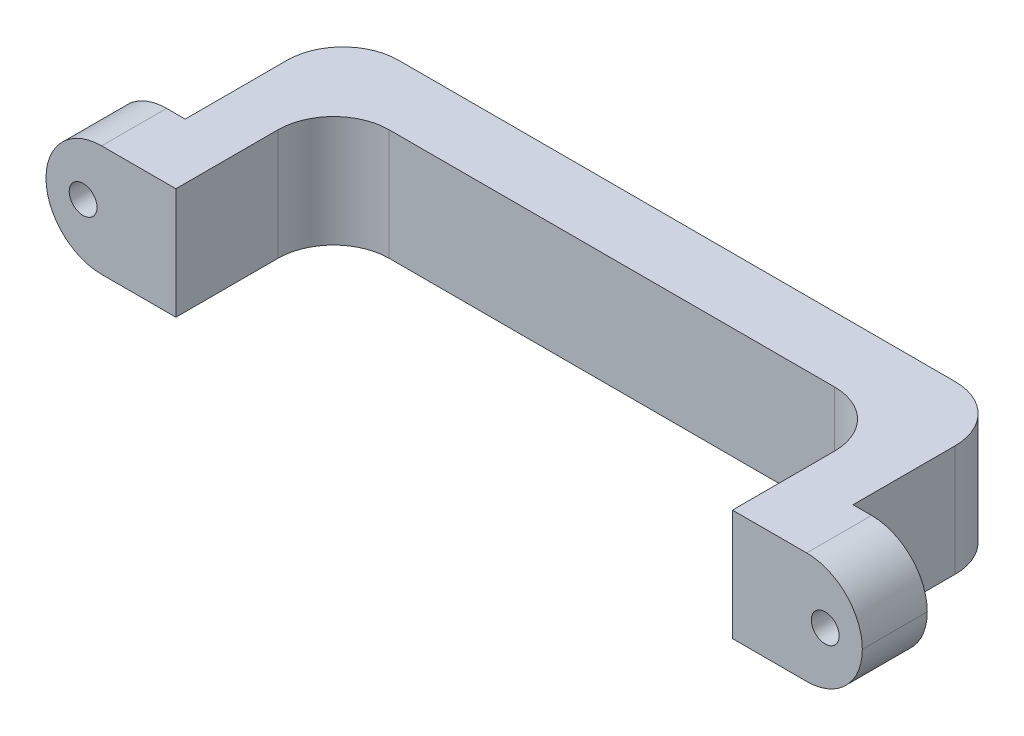
ISO-10303-21;
HEADER;
FILE_DESCRIPTION(('STEP AP214'),'2;1');
FILE_NAME('part.step','',(''),(''),'','','');
FILE_SCHEMA(('AUTOMOTIVE_DESIGN { 1 0 10303 214 1 1 1 1 }'));
ENDSEC;
DATA;
#1=APPLICATION_CONTEXT('core data for automotive mechanical design processes');
#2=APPLICATION_PROTOCOL_DEFINITION('international standard','automotive_design',2000,#1);
#3=PRODUCT_CONTEXT('',#1,'mechanical');
#4=PRODUCT('Part','Part','',(#3));
#5=PRODUCT_RELATED_PRODUCT_CATEGORY('part','',(#4));
#6=PRODUCT_DEFINITION_FORMATION('','',#4);
#7=PRODUCT_DEFINITION_CONTEXT('part definition',#1,'design');
#8=PRODUCT_DEFINITION('design','',#6,#7);
#9=PRODUCT_DEFINITION_SHAPE('','',#8);
#10=(LENGTH_UNIT() NAMED_UNIT(*) SI_UNIT(.MILLI.,.METRE.));
#11=(NAMED_UNIT(*) PLANE_ANGLE_UNIT() SI_UNIT($,.RADIAN.));
#12=(NAMED_UNIT(*) SI_UNIT($,.STERADIAN.) SOLID_ANGLE_UNIT());
#13=UNCERTAINTY_MEASURE_WITH_UNIT(LENGTH_MEASURE(1.E-05),#10,'distance_accuracy_value','');
#14=(GEOMETRIC_REPRESENTATION_CONTEXT(3) GLOBAL_UNCERTAINTY_ASSIGNED_CONTEXT((#13)) GLOBAL_UNIT_ASSIGNED_CONTEXT((#10,
#11,#12)) REPRESENTATION_CONTEXT('',''));
#15=CARTESIAN_POINT('',(0.,0.,0.));
#16=DIRECTION('',(0.,0.,1.));
#17=DIRECTION('',(1.,0.,0.));
#18=AXIS2_PLACEMENT_3D('',#15,#16,#17);
#19=CARTESIAN_POINT('',(0.,12.,0.));
#20=DIRECTION('',(0.,0.,-1.));
#21=DIRECTION('',(-1.,0.,0.));
#22=AXIS2_PLACEMENT_3D('',#19,#20,#21);
#23=PLANE('',#22);
#24=CARTESIAN_POINT('',(4.,6.,0.));
#25=DIRECTION('',(0.,0.,-1.));
#26=DIRECTION('',(-1.,0.,0.));
#27=AXIS2_PLACEMENT_3D('',#24,#25,#26);
#28=CIRCLE('',#27,1.5);
#29=CARTESIAN_POINT('',(2.5,6.,0.));
#30=VERTEX_POINT('',#29);
#31=EDGE_CURVE('E339',#30,#30,#28,.T.);
#32=ORIENTED_EDGE('',*,*,#31,.T.);
#33=EDGE_LOOP('',(#32));
#34=FACE_BOUND('',#33,.T.);
#35=DIRECTION('',(1.,0.,0.));
#36=VECTOR('',#35,1.);
#37=CARTESIAN_POINT('',(0.,12.,0.));
#38=LINE('',#37,#36);
#39=CARTESIAN_POINT('',(6.,12.,0.));
#40=VERTEX_POINT('',#39);
#41=CARTESIAN_POINT('',(14.,12.,0.));
#42=VERTEX_POINT('',#41);
#43=EDGE_CURVE('E162',#40,#42,#38,.T.);
#44=ORIENTED_EDGE('',*,*,#43,.F.);
#45=CARTESIAN_POINT('',(6.,6.,0.));
#46=DIRECTION('',(0.,0.,-1.));
#47=DIRECTION('',(-1.,0.,0.));
#48=AXIS2_PLACEMENT_3D('',#45,#46,#47);
#49=CIRCLE('',#48,6.);
#50=CARTESIAN_POINT('',(0.,6.,0.));
#51=VERTEX_POINT('',#50);
#52=EDGE_CURVE('E203',#40,#51,#49,.F.);
#53=ORIENTED_EDGE('',*,*,#52,.T.);
#54=CARTESIAN_POINT('',(6.,6.,0.));
#55=DIRECTION('',(0.,0.,-1.));
#56=DIRECTION('',(-1.,0.,0.));
#57=AXIS2_PLACEMENT_3D('',#54,#55,#56);
#58=CIRCLE('',#57,6.);
#59=CARTESIAN_POINT('',(6.,0.,0.));
#60=VERTEX_POINT('',#59);
#61=EDGE_CURVE('E201',#51,#60,#58,.F.);
#62=ORIENTED_EDGE('',*,*,#61,.T.);
#63=DIRECTION('',(1.,0.,0.));
#64=VECTOR('',#63,1.);
#65=CARTESIAN_POINT('',(0.,0.,0.));
#66=LINE('',#65,#64);
#67=CARTESIAN_POINT('',(14.,0.,0.));
#68=VERTEX_POINT('',#67);
#69=EDGE_CURVE('E184',#60,#68,#66,.T.);
#70=ORIENTED_EDGE('',*,*,#69,.T.);
#71=DIRECTION('',(0.,-1.,0.));
#72=VECTOR('',#71,1.);
#73=CARTESIAN_POINT('',(14.,12.,0.));
#74=LINE('',#73,#72);
#75=EDGE_CURVE('E178',#42,#68,#74,.T.);
#76=ORIENTED_EDGE('',*,*,#75,.F.);
#77=EDGE_LOOP('',(#44,#53,#62,#70,#76));
#78=FACE_BOUND('',#77,.T.);
#79=ADVANCED_FACE('F34',(#34,#78),#23,.F.);
#80=CARTESIAN_POINT('',(14.,12.,0.));
#81=DIRECTION('',(-1.,0.,0.));
#82=DIRECTION('',(0.,0.,1.));
#83=AXIS2_PLACEMENT_3D('',#80,#81,#82);
#84=PLANE('',#83);
#85=DIRECTION('',(0.,0.,-1.));
#86=VECTOR('',#85,1.);
#87=CARTESIAN_POINT('',(14.,0.,0.));
#88=LINE('',#87,#86);
#89=CARTESIAN_POINT('',(14.,0.,-11.));
#90=VERTEX_POINT('',#89);
#91=EDGE_CURVE('E313',#68,#90,#88,.T.);
#92=ORIENTED_EDGE('',*,*,#91,.T.);
#93=DIRECTION('',(0.,-1.,0.));
#94=VECTOR('',#93,1.);
#95=CARTESIAN_POINT('',(14.,12.,-11.));
#96=LINE('',#95,#94);
#97=CARTESIAN_POINT('',(14.,12.,-11.));
#98=VERTEX_POINT('',#97);
#99=EDGE_CURVE('E180',#90,#98,#96,.F.);
#100=ORIENTED_EDGE('',*,*,#99,.T.);
#101=DIRECTION('',(0.,0.,-1.));
#102=VECTOR('',#101,1.);
#103=CARTESIAN_POINT('',(14.,12.,0.));
#104=LINE('',#103,#102);
#105=EDGE_CURVE('E166',#42,#98,#104,.T.);
#106=ORIENTED_EDGE('',*,*,#105,.F.);
#107=ORIENTED_EDGE('',*,*,#75,.T.);
#108=EDGE_LOOP('',(#92,#100,#106,#107));
#109=FACE_BOUND('',#108,.T.);
#110=ADVANCED_FACE('F177',(#109),#84,.F.);
#111=CARTESIAN_POINT('',(74.,12.,-17.));
#112=DIRECTION('',(0.,0.,1.));
#113=DIRECTION('',(1.,0.,0.));
#114=AXIS2_PLACEMENT_3D('',#111,#112,#113);
#115=PLANE('',#114);
#116=DIRECTION('',(-1.,0.,0.));
#117=VECTOR('',#116,1.);
#118=CARTESIAN_POINT('',(74.,12.,-17.));
#119=LINE('',#118,#117);
#120=CARTESIAN_POINT('',(68.,12.,-17.));
#121=VERTEX_POINT('',#120);
#122=CARTESIAN_POINT('',(20.,12.,-17.));
#123=VERTEX_POINT('',#122);
#124=EDGE_CURVE('E181',#121,#123,#119,.T.);
#125=ORIENTED_EDGE('',*,*,#124,.T.);
#126=DIRECTION('',(0.,-1.,0.));
#127=VECTOR('',#126,1.);
#128=CARTESIAN_POINT('',(20.,12.,-17.));
#129=LINE('',#128,#127);
#130=CARTESIAN_POINT('',(20.,0.,-17.));
#131=VERTEX_POINT('',#130);
#132=EDGE_CURVE('E225',#123,#131,#129,.T.);
#133=ORIENTED_EDGE('',*,*,#132,.T.);
#134=DIRECTION('',(-1.,0.,0.));
#135=VECTOR('',#134,1.);
#136=CARTESIAN_POINT('',(74.,0.,-17.));
#137=LINE('',#136,#135);
#138=CARTESIAN_POINT('',(68.,0.,-17.));
#139=VERTEX_POINT('',#138);
#140=EDGE_CURVE('E316',#139,#131,#137,.T.);
#141=ORIENTED_EDGE('',*,*,#140,.F.);
#142=DIRECTION('',(0.,-1.,0.));
#143=VECTOR('',#142,1.);
#144=CARTESIAN_POINT('',(68.,12.,-17.));
#145=LINE('',#144,#143);
#146=EDGE_CURVE('E223',#139,#121,#145,.F.);
#147=ORIENTED_EDGE('',*,*,#146,.T.);
#148=EDGE_LOOP('',(#125,#133,#141,#147));
#149=FACE_BOUND('',#148,.T.);
#150=ADVANCED_FACE('F333',(#149),#115,.T.);
#151=CARTESIAN_POINT('',(74.,12.,0.));
#152=DIRECTION('',(-1.,0.,0.));
#153=DIRECTION('',(0.,0.,1.));
#154=AXIS2_PLACEMENT_3D('',#151,#152,#153);
#155=PLANE('',#154);
#156=DIRECTION('',(0.,0.,-1.));
#157=VECTOR('',#156,1.);
#158=CARTESIAN_POINT('',(74.,12.,0.));
#159=LINE('',#158,#157);
#160=CARTESIAN_POINT('',(74.,12.,0.));
#161=VERTEX_POINT('',#160);
#162=CARTESIAN_POINT('',(74.,12.,-11.));
#163=VERTEX_POINT('',#162);
#164=EDGE_CURVE('E303',#161,#163,#159,.T.);
#165=ORIENTED_EDGE('',*,*,#164,.T.);
#166=DIRECTION('',(0.,-1.,0.));
#167=VECTOR('',#166,1.);
#168=CARTESIAN_POINT('',(74.,0.,-11.));
#169=LINE('',#168,#167);
#170=CARTESIAN_POINT('',(74.,0.,-11.));
#171=VERTEX_POINT('',#170);
#172=EDGE_CURVE('E239',#163,#171,#169,.T.);
#173=ORIENTED_EDGE('',*,*,#172,.T.);
#174=DIRECTION('',(0.,0.,-1.));
#175=VECTOR('',#174,1.);
#176=CARTESIAN_POINT('',(74.,0.,0.));
#177=LINE('',#176,#175);
#178=CARTESIAN_POINT('',(74.,0.,0.));
#179=VERTEX_POINT('',#178);
#180=EDGE_CURVE('E277',#179,#171,#177,.T.);
#181=ORIENTED_EDGE('',*,*,#180,.F.);
#182=DIRECTION('',(0.,-1.,0.));
#183=VECTOR('',#182,1.);
#184=CARTESIAN_POINT('',(74.,12.,0.));
#185=LINE('',#184,#183);
#186=EDGE_CURVE('E187',#161,#179,#185,.T.);
#187=ORIENTED_EDGE('',*,*,#186,.F.);
#188=EDGE_LOOP('',(#165,#173,#181,#187));
#189=FACE_BOUND('',#188,.T.);
#190=ADVANCED_FACE('F324',(#189),#155,.T.);
#191=CARTESIAN_POINT('',(88.,12.,0.));
#192=DIRECTION('',(0.,0.,1.));
#193=DIRECTION('',(1.,0.,0.));
#194=AXIS2_PLACEMENT_3D('',#191,#192,#193);
#195=PLANE('',#194);
#196=CARTESIAN_POINT('',(84.,6.,0.));
#197=DIRECTION('',(0.,0.,1.));
#198=DIRECTION('',(1.,0.,0.));
#199=AXIS2_PLACEMENT_3D('',#196,#197,#198);
#200=CIRCLE('',#199,1.50000000000001);
#201=CARTESIAN_POINT('',(85.5,6.,0.));
#202=VERTEX_POINT('',#201);
#203=EDGE_CURVE('E314',#202,#202,#200,.T.);
#204=ORIENTED_EDGE('',*,*,#203,.F.);
#205=EDGE_LOOP('',(#204));
#206=FACE_BOUND('',#205,.T.);
#207=CARTESIAN_POINT('',(82.,6.,0.));
#208=DIRECTION('',(0.,0.,1.));
#209=DIRECTION('',(1.,0.,0.));
#210=AXIS2_PLACEMENT_3D('',#207,#208,#209);
#211=CIRCLE('',#210,6.);
#212=CARTESIAN_POINT('',(82.,0.,0.));
#213=VERTEX_POINT('',#212);
#214=CARTESIAN_POINT('',(88.,6.,0.));
#215=VERTEX_POINT('',#214);
#216=EDGE_CURVE('E59',#213,#215,#211,.T.);
#217=ORIENTED_EDGE('',*,*,#216,.T.);
#218=CARTESIAN_POINT('',(82.,6.,0.));
#219=DIRECTION('',(0.,0.,1.));
#220=DIRECTION('',(1.,0.,0.));
#221=AXIS2_PLACEMENT_3D('',#218,#219,#220);
#222=CIRCLE('',#221,6.);
#223=CARTESIAN_POINT('',(82.,12.,0.));
#224=VERTEX_POINT('',#223);
#225=EDGE_CURVE('E218',#215,#224,#222,.T.);
#226=ORIENTED_EDGE('',*,*,#225,.T.);
#227=DIRECTION('',(-1.,0.,0.));
#228=VECTOR('',#227,1.);
#229=CARTESIAN_POINT('',(88.,12.,0.));
#230=LINE('',#229,#228);
#231=EDGE_CURVE('E299',#224,#161,#230,.T.);
#232=ORIENTED_EDGE('',*,*,#231,.T.);
#233=ORIENTED_EDGE('',*,*,#186,.T.);
#234=DIRECTION('',(-1.,0.,0.));
#235=VECTOR('',#234,1.);
#236=CARTESIAN_POINT('',(88.,0.,0.));
#237=LINE('',#236,#235);
#238=EDGE_CURVE('E273',#213,#179,#237,.T.);
#239=ORIENTED_EDGE('',*,*,#238,.F.);
#240=EDGE_LOOP('',(#217,#226,#232,#233,#239));
#241=FACE_BOUND('',#240,.T.);
#242=ADVANCED_FACE('F451',(#206,#241),#195,.T.);
#243=CARTESIAN_POINT('',(80.,12.,-7.));
#244=DIRECTION('',(0.,0.,-1.));
#245=DIRECTION('',(-1.,0.,0.));
#246=AXIS2_PLACEMENT_3D('',#243,#244,#245);
#247=PLANE('',#246);
#248=CARTESIAN_POINT('',(84.,6.,-7.00000000000001));
#249=DIRECTION('',(0.,0.,-1.));
#250=DIRECTION('',(-1.,0.,0.));
#251=AXIS2_PLACEMENT_3D('',#248,#249,#250);
#252=CIRCLE('',#251,1.50000000000001);
#253=CARTESIAN_POINT('',(82.5,6.,-7.00000000000001));
#254=VERTEX_POINT('',#253);
#255=EDGE_CURVE('E248',#254,#254,#252,.T.);
#256=ORIENTED_EDGE('',*,*,#255,.F.);
#257=EDGE_LOOP('',(#256));
#258=FACE_BOUND('',#257,.T.);
#259=DIRECTION('',(1.,0.,0.));
#260=VECTOR('',#259,1.);
#261=CARTESIAN_POINT('',(80.,12.,-7.));
#262=LINE('',#261,#260);
#263=CARTESIAN_POINT('',(80.,12.,-7.));
#264=VERTEX_POINT('',#263);
#265=CARTESIAN_POINT('',(82.,12.,-7.));
#266=VERTEX_POINT('',#265);
#267=EDGE_CURVE('E296',#264,#266,#262,.T.);
#268=ORIENTED_EDGE('',*,*,#267,.T.);
#269=CARTESIAN_POINT('',(82.,6.,-7.));
#270=DIRECTION('',(0.,0.,-1.));
#271=DIRECTION('',(-1.,0.,0.));
#272=AXIS2_PLACEMENT_3D('',#269,#270,#271);
#273=CIRCLE('',#272,6.);
#274=CARTESIAN_POINT('',(88.,6.,-7.));
#275=VERTEX_POINT('',#274);
#276=EDGE_CURVE('E51',#266,#275,#273,.T.);
#277=ORIENTED_EDGE('',*,*,#276,.T.);
#278=CARTESIAN_POINT('',(82.,6.,-7.));
#279=DIRECTION('',(0.,0.,-1.));
#280=DIRECTION('',(-1.,0.,0.));
#281=AXIS2_PLACEMENT_3D('',#278,#279,#280);
#282=CIRCLE('',#281,6.);
#283=CARTESIAN_POINT('',(82.,0.,-7.));
#284=VERTEX_POINT('',#283);
#285=EDGE_CURVE('E220',#275,#284,#282,.T.);
#286=ORIENTED_EDGE('',*,*,#285,.T.);
#287=DIRECTION('',(1.,0.,0.));
#288=VECTOR('',#287,1.);
#289=CARTESIAN_POINT('',(80.,0.,-7.));
#290=LINE('',#289,#288);
#291=CARTESIAN_POINT('',(80.,0.,-7.));
#292=VERTEX_POINT('',#291);
#293=EDGE_CURVE('E267',#292,#284,#290,.T.);
#294=ORIENTED_EDGE('',*,*,#293,.F.);
#295=DIRECTION('',(0.,-1.,0.));
#296=VECTOR('',#295,1.);
#297=CARTESIAN_POINT('',(80.,12.,-7.));
#298=LINE('',#297,#296);
#299=EDGE_CURVE('E192',#264,#292,#298,.T.);
#300=ORIENTED_EDGE('',*,*,#299,.F.);
#301=EDGE_LOOP('',(#268,#277,#286,#294,#300));
#302=FACE_BOUND('',#301,.T.);
#303=ADVANCED_FACE('F265',(#258,#302),#247,.T.);
#304=CARTESIAN_POINT('',(80.,12.,-24.));
#305=DIRECTION('',(1.,0.,0.));
#306=DIRECTION('',(0.,0.,-1.));
#307=AXIS2_PLACEMENT_3D('',#304,#305,#306);
#308=PLANE('',#307);
#309=DIRECTION('',(0.,0.,1.));
#310=VECTOR('',#309,1.);
#311=CARTESIAN_POINT('',(80.,0.,-24.));
#312=LINE('',#311,#310);
#313=CARTESIAN_POINT('',(80.,0.,-18.));
#314=VERTEX_POINT('',#313);
#315=EDGE_CURVE('E271',#314,#292,#312,.T.);
#316=ORIENTED_EDGE('',*,*,#315,.F.);
#317=DIRECTION('',(0.,-1.,0.));
#318=VECTOR('',#317,1.);
#319=CARTESIAN_POINT('',(80.,12.,-18.));
#320=LINE('',#319,#318);
#321=CARTESIAN_POINT('',(80.,12.,-18.));
#322=VERTEX_POINT('',#321);
#323=EDGE_CURVE('E237',#314,#322,#320,.F.);
#324=ORIENTED_EDGE('',*,*,#323,.T.);
#325=DIRECTION('',(0.,0.,1.));
#326=VECTOR('',#325,1.);
#327=CARTESIAN_POINT('',(80.,12.,-24.));
#328=LINE('',#327,#326);
#329=EDGE_CURVE('E294',#322,#264,#328,.T.);
#330=ORIENTED_EDGE('',*,*,#329,.T.);
#331=ORIENTED_EDGE('',*,*,#299,.T.);
#332=EDGE_LOOP('',(#316,#324,#330,#331));
#333=FACE_BOUND('',#332,.T.);
#334=ADVANCED_FACE('F291',(#333),#308,.T.);
#335=CARTESIAN_POINT('',(8.,12.,-24.));
#336=DIRECTION('',(0.,0.,-1.));
#337=DIRECTION('',(-1.,0.,0.));
#338=AXIS2_PLACEMENT_3D('',#335,#336,#337);
#339=PLANE('',#338);
#340=DIRECTION('',(1.,0.,0.));
#341=VECTOR('',#340,1.);
#342=CARTESIAN_POINT('',(8.,0.,-24.));
#343=LINE('',#342,#341);
#344=CARTESIAN_POINT('',(14.,0.,-24.));
#345=VERTEX_POINT('',#344);
#346=CARTESIAN_POINT('',(74.,0.,-24.));
#347=VERTEX_POINT('',#346);
#348=EDGE_CURVE('E275',#345,#347,#343,.T.);
#349=ORIENTED_EDGE('',*,*,#348,.F.);
#350=DIRECTION('',(0.,-1.,0.));
#351=VECTOR('',#350,1.);
#352=CARTESIAN_POINT('',(14.,12.,-24.));
#353=LINE('',#352,#351);
#354=CARTESIAN_POINT('',(14.,12.,-24.));
#355=VERTEX_POINT('',#354);
#356=EDGE_CURVE('E235',#345,#355,#353,.F.);
#357=ORIENTED_EDGE('',*,*,#356,.T.);
#358=DIRECTION('',(1.,0.,0.));
#359=VECTOR('',#358,1.);
#360=CARTESIAN_POINT('',(8.,12.,-24.));
#361=LINE('',#360,#359);
#362=CARTESIAN_POINT('',(74.,12.,-24.));
#363=VERTEX_POINT('',#362);
#364=EDGE_CURVE('E301',#355,#363,#361,.T.);
#365=ORIENTED_EDGE('',*,*,#364,.T.);
#366=DIRECTION('',(0.,-1.,0.));
#367=VECTOR('',#366,1.);
#368=CARTESIAN_POINT('',(74.,12.,-24.));
#369=LINE('',#368,#367);
#370=EDGE_CURVE('E232',#363,#347,#369,.T.);
#371=ORIENTED_EDGE('',*,*,#370,.T.);
#372=EDGE_LOOP('',(#349,#357,#365,#371));
#373=FACE_BOUND('',#372,.T.);
#374=ADVANCED_FACE('F432',(#373),#339,.T.);
#375=CARTESIAN_POINT('',(8.,12.,-24.));
#376=DIRECTION('',(1.,0.,0.));
#377=DIRECTION('',(0.,0.,-1.));
#378=AXIS2_PLACEMENT_3D('',#375,#376,#377);
#379=PLANE('',#378);
#380=DIRECTION('',(0.,0.,1.));
#381=VECTOR('',#380,1.);
#382=CARTESIAN_POINT('',(8.,12.,-24.));
#383=LINE('',#382,#381);
#384=CARTESIAN_POINT('',(8.,12.,-18.));
#385=VERTEX_POINT('',#384);
#386=CARTESIAN_POINT('',(8.,12.,-7.));
#387=VERTEX_POINT('',#386);
#388=EDGE_CURVE('E309',#385,#387,#383,.T.);
#389=ORIENTED_EDGE('',*,*,#388,.F.);
#390=DIRECTION('',(0.,-1.,0.));
#391=VECTOR('',#390,1.);
#392=CARTESIAN_POINT('',(8.,0.,-18.));
#393=LINE('',#392,#391);
#394=CARTESIAN_POINT('',(8.,0.,-18.));
#395=VERTEX_POINT('',#394);
#396=EDGE_CURVE('E229',#385,#395,#393,.T.);
#397=ORIENTED_EDGE('',*,*,#396,.T.);
#398=DIRECTION('',(0.,0.,1.));
#399=VECTOR('',#398,1.);
#400=CARTESIAN_POINT('',(8.,0.,-24.));
#401=LINE('',#400,#399);
#402=CARTESIAN_POINT('',(8.,0.,-7.));
#403=VERTEX_POINT('',#402);
#404=EDGE_CURVE('E283',#395,#403,#401,.T.);
#405=ORIENTED_EDGE('',*,*,#404,.T.);
#406=DIRECTION('',(0.,-1.,0.));
#407=VECTOR('',#406,1.);
#408=CARTESIAN_POINT('',(8.,12.,-7.));
#409=LINE('',#408,#407);
#410=EDGE_CURVE('E287',#387,#403,#409,.T.);
#411=ORIENTED_EDGE('',*,*,#410,.F.);
#412=EDGE_LOOP('',(#389,#397,#405,#411));
#413=FACE_BOUND('',#412,.T.);
#414=ADVANCED_FACE('F351',(#413),#379,.F.);
#415=CARTESIAN_POINT('',(8.,12.,-7.));
#416=DIRECTION('',(0.,0.,1.));
#417=DIRECTION('',(1.,0.,0.));
#418=AXIS2_PLACEMENT_3D('',#415,#416,#417);
#419=PLANE('',#418);
#420=CARTESIAN_POINT('',(4.,6.,-7.));
#421=DIRECTION('',(0.,0.,-1.));
#422=DIRECTION('',(-1.,0.,0.));
#423=AXIS2_PLACEMENT_3D('',#420,#421,#422);
#424=CIRCLE('',#423,1.5);
#425=CARTESIAN_POINT('',(2.5,6.,-7.));
#426=VERTEX_POINT('',#425);
#427=EDGE_CURVE('E253',#426,#426,#424,.T.);
#428=ORIENTED_EDGE('',*,*,#427,.F.);
#429=EDGE_LOOP('',(#428));
#430=FACE_BOUND('',#429,.T.);
#431=CARTESIAN_POINT('',(6.,6.,-7.));
#432=DIRECTION('',(0.,0.,1.));
#433=DIRECTION('',(1.,0.,0.));
#434=AXIS2_PLACEMENT_3D('',#431,#432,#433);
#435=CIRCLE('',#434,6.);
#436=CARTESIAN_POINT('',(6.,0.,-7.));
#437=VERTEX_POINT('',#436);
#438=CARTESIAN_POINT('',(0.,6.,-7.));
#439=VERTEX_POINT('',#438);
#440=EDGE_CURVE('E205',#437,#439,#435,.F.);
#441=ORIENTED_EDGE('',*,*,#440,.T.);
#442=CARTESIAN_POINT('',(6.,6.,-7.));
#443=DIRECTION('',(0.,0.,1.));
#444=DIRECTION('',(1.,0.,0.));
#445=AXIS2_PLACEMENT_3D('',#442,#443,#444);
#446=CIRCLE('',#445,6.);
#447=CARTESIAN_POINT('',(6.,12.,-7.));
#448=VERTEX_POINT('',#447);
#449=EDGE_CURVE('E207',#439,#448,#446,.F.);
#450=ORIENTED_EDGE('',*,*,#449,.T.);
#451=DIRECTION('',(-1.,0.,0.));
#452=VECTOR('',#451,1.);
#453=CARTESIAN_POINT('',(8.,12.,-7.));
#454=LINE('',#453,#452);
#455=EDGE_CURVE('E289',#387,#448,#454,.T.);
#456=ORIENTED_EDGE('',*,*,#455,.F.);
#457=ORIENTED_EDGE('',*,*,#410,.T.);
#458=DIRECTION('',(-1.,0.,0.));
#459=VECTOR('',#458,1.);
#460=CARTESIAN_POINT('',(8.,0.,-7.));
#461=LINE('',#460,#459);
#462=EDGE_CURVE('E172',#403,#437,#461,.T.);
#463=ORIENTED_EDGE('',*,*,#462,.T.);
#464=EDGE_LOOP('',(#441,#450,#456,#457,#463));
#465=FACE_BOUND('',#464,.T.);
#466=ADVANCED_FACE('F348',(#430,#465),#419,.F.);
#467=CARTESIAN_POINT('',(0.,12.,0.));
#468=DIRECTION('',(0.,1.,0.));
#469=DIRECTION('',(0.,0.,1.));
#470=AXIS2_PLACEMENT_3D('',#467,#468,#469);
#471=PLANE('',#470);
#472=ORIENTED_EDGE('',*,*,#455,.T.);
#473=DIRECTION('',(0.,0.,1.));
#474=VECTOR('',#473,1.);
#475=CARTESIAN_POINT('',(6.,12.,0.));
#476=LINE('',#475,#474);
#477=EDGE_CURVE('E169',#448,#40,#476,.T.);
#478=ORIENTED_EDGE('',*,*,#477,.T.);
#479=ORIENTED_EDGE('',*,*,#43,.T.);
#480=ORIENTED_EDGE('',*,*,#105,.T.);
#481=CARTESIAN_POINT('',(20.,12.,-11.));
#482=DIRECTION('',(0.,1.,0.));
#483=DIRECTION('',(0.,0.,1.));
#484=AXIS2_PLACEMENT_3D('',#481,#482,#483);
#485=CIRCLE('',#484,6.);
#486=EDGE_CURVE('E244',#98,#123,#485,.F.);
#487=ORIENTED_EDGE('',*,*,#486,.T.);
#488=ORIENTED_EDGE('',*,*,#124,.F.);
#489=CARTESIAN_POINT('',(68.,12.,-11.));
#490=DIRECTION('',(0.,1.,0.));
#491=DIRECTION('',(0.,0.,1.));
#492=AXIS2_PLACEMENT_3D('',#489,#490,#491);
#493=CIRCLE('',#492,6.);
#494=EDGE_CURVE('E11',#121,#163,#493,.F.);
#495=ORIENTED_EDGE('',*,*,#494,.T.);
#496=ORIENTED_EDGE('',*,*,#164,.F.);
#497=ORIENTED_EDGE('',*,*,#231,.F.);
#498=DIRECTION('',(0.,0.,1.));
#499=VECTOR('',#498,1.);
#500=CARTESIAN_POINT('',(82.,12.,0.));
#501=LINE('',#500,#499);
#502=EDGE_CURVE('E197',#224,#266,#501,.F.);
#503=ORIENTED_EDGE('',*,*,#502,.T.);
#504=ORIENTED_EDGE('',*,*,#267,.F.);
#505=ORIENTED_EDGE('',*,*,#329,.F.);
#506=CARTESIAN_POINT('',(74.,12.,-18.));
#507=DIRECTION('',(0.,1.,0.));
#508=DIRECTION('',(0.,0.,1.));
#509=AXIS2_PLACEMENT_3D('',#506,#507,#508);
#510=CIRCLE('',#509,6.);
#511=EDGE_CURVE('E186',#322,#363,#510,.T.);
#512=ORIENTED_EDGE('',*,*,#511,.T.);
#513=ORIENTED_EDGE('',*,*,#364,.F.);
#514=CARTESIAN_POINT('',(14.,12.,-18.));
#515=DIRECTION('',(0.,1.,0.));
#516=DIRECTION('',(0.,0.,1.));
#517=AXIS2_PLACEMENT_3D('',#514,#515,#516);
#518=CIRCLE('',#517,6.);
#519=EDGE_CURVE('E189',#355,#385,#518,.T.);
#520=ORIENTED_EDGE('',*,*,#519,.T.);
#521=ORIENTED_EDGE('',*,*,#388,.T.);
#522=EDGE_LOOP('',(#472,#478,#479,#480,#487,#488,#495,#496,#497,#503,#504,#505,#512,#513,#520,#521));
#523=FACE_BOUND('',#522,.T.);
#524=ADVANCED_FACE('F165',(#523),#471,.T.);
#525=CARTESIAN_POINT('',(0.,0.,0.));
#526=DIRECTION('',(0.,1.,0.));
#527=DIRECTION('',(0.,0.,1.));
#528=AXIS2_PLACEMENT_3D('',#525,#526,#527);
#529=PLANE('',#528);
#530=ORIENTED_EDGE('',*,*,#69,.F.);
#531=DIRECTION('',(0.,0.,1.));
#532=VECTOR('',#531,1.);
#533=CARTESIAN_POINT('',(6.,0.,0.));
#534=LINE('',#533,#532);
#535=EDGE_CURVE('E215',#60,#437,#534,.F.);
#536=ORIENTED_EDGE('',*,*,#535,.T.);
#537=ORIENTED_EDGE('',*,*,#462,.F.);
#538=ORIENTED_EDGE('',*,*,#404,.F.);
#539=CARTESIAN_POINT('',(14.,0.,-18.));
#540=DIRECTION('',(0.,1.,0.));
#541=DIRECTION('',(0.,0.,1.));
#542=AXIS2_PLACEMENT_3D('',#539,#540,#541);
#543=CIRCLE('',#542,6.);
#544=EDGE_CURVE('E211',#395,#345,#543,.F.);
#545=ORIENTED_EDGE('',*,*,#544,.T.);
#546=ORIENTED_EDGE('',*,*,#348,.T.);
#547=CARTESIAN_POINT('',(74.,0.,-18.));
#548=DIRECTION('',(0.,1.,0.));
#549=DIRECTION('',(0.,0.,1.));
#550=AXIS2_PLACEMENT_3D('',#547,#548,#549);
#551=CIRCLE('',#550,6.);
#552=EDGE_CURVE('E209',#347,#314,#551,.F.);
#553=ORIENTED_EDGE('',*,*,#552,.T.);
#554=ORIENTED_EDGE('',*,*,#315,.T.);
#555=ORIENTED_EDGE('',*,*,#293,.T.);
#556=DIRECTION('',(0.,0.,1.));
#557=VECTOR('',#556,1.);
#558=CARTESIAN_POINT('',(82.,0.,0.));
#559=LINE('',#558,#557);
#560=EDGE_CURVE('E213',#284,#213,#559,.T.);
#561=ORIENTED_EDGE('',*,*,#560,.T.);
#562=ORIENTED_EDGE('',*,*,#238,.T.);
#563=ORIENTED_EDGE('',*,*,#180,.T.);
#564=CARTESIAN_POINT('',(68.,0.,-11.));
#565=DIRECTION('',(0.,1.,0.));
#566=DIRECTION('',(0.,0.,1.));
#567=AXIS2_PLACEMENT_3D('',#564,#565,#566);
#568=CIRCLE('',#567,6.);
#569=EDGE_CURVE('E43',#171,#139,#568,.T.);
#570=ORIENTED_EDGE('',*,*,#569,.T.);
#571=ORIENTED_EDGE('',*,*,#140,.T.);
#572=CARTESIAN_POINT('',(20.,0.,-11.));
#573=DIRECTION('',(0.,1.,0.));
#574=DIRECTION('',(0.,0.,1.));
#575=AXIS2_PLACEMENT_3D('',#572,#573,#574);
#576=CIRCLE('',#575,6.);
#577=EDGE_CURVE('E242',#131,#90,#576,.T.);
#578=ORIENTED_EDGE('',*,*,#577,.T.);
#579=ORIENTED_EDGE('',*,*,#91,.F.);
#580=EDGE_LOOP('',(#530,#536,#537,#538,#545,#546,#553,#554,#555,#561,#562,#563,#570,#571,#578,#579));
#581=FACE_BOUND('',#580,.T.);
#582=ADVANCED_FACE('F269',(#581),#529,.F.);
#583=CARTESIAN_POINT('',(4.,6.,5.));
#584=DIRECTION('',(0.,0.,-1.));
#585=DIRECTION('',(-1.,0.,0.));
#586=AXIS2_PLACEMENT_3D('',#583,#584,#585);
#587=CYLINDRICAL_SURFACE('',#586,1.5);
#588=ORIENTED_EDGE('',*,*,#427,.T.);
#589=EDGE_LOOP('',(#588));
#590=FACE_BOUND('',#589,.T.);
#591=ORIENTED_EDGE('',*,*,#31,.F.);
#592=EDGE_LOOP('',(#591));
#593=FACE_BOUND('',#592,.T.);
#594=ADVANCED_FACE('F345',(#590,#593),#587,.F.);
#595=CARTESIAN_POINT('',(84.,6.,4.99999999999999));
#596=DIRECTION('',(0.,0.,-1.));
#597=DIRECTION('',(-1.,0.,0.));
#598=AXIS2_PLACEMENT_3D('',#595,#596,#597);
#599=CYLINDRICAL_SURFACE('',#598,1.50000000000001);
#600=ORIENTED_EDGE('',*,*,#203,.T.);
#601=EDGE_LOOP('',(#600));
#602=FACE_BOUND('',#601,.T.);
#603=ORIENTED_EDGE('',*,*,#255,.T.);
#604=EDGE_LOOP('',(#603));
#605=FACE_BOUND('',#604,.T.);
#606=ADVANCED_FACE('F388',(#602,#605),#599,.F.);
#607=CARTESIAN_POINT('',(6.,6.,-7.));
#608=DIRECTION('',(0.,0.,1.));
#609=DIRECTION('',(1.,0.,0.));
#610=AXIS2_PLACEMENT_3D('',#607,#608,#609);
#611=CYLINDRICAL_SURFACE('',#610,6.);
#612=DIRECTION('',(0.,0.,1.));
#613=VECTOR('',#612,1.);
#614=CARTESIAN_POINT('',(0.,6.,-7.));
#615=LINE('',#614,#613);
#616=EDGE_CURVE('E246',#439,#51,#615,.T.);
#617=ORIENTED_EDGE('',*,*,#616,.F.);
#618=ORIENTED_EDGE('',*,*,#440,.F.);
#619=ORIENTED_EDGE('',*,*,#535,.F.);
#620=ORIENTED_EDGE('',*,*,#61,.F.);
#621=EDGE_LOOP('',(#617,#618,#619,#620));
#622=FACE_BOUND('',#621,.T.);
#623=ADVANCED_FACE('F359',(#622),#611,.T.);
#624=CARTESIAN_POINT('',(6.,6.,0.));
#625=DIRECTION('',(0.,0.,-1.));
#626=DIRECTION('',(-1.,0.,0.));
#627=AXIS2_PLACEMENT_3D('',#624,#625,#626);
#628=CYLINDRICAL_SURFACE('',#627,6.);
#629=ORIENTED_EDGE('',*,*,#449,.F.);
#630=ORIENTED_EDGE('',*,*,#616,.T.);
#631=ORIENTED_EDGE('',*,*,#52,.F.);
#632=ORIENTED_EDGE('',*,*,#477,.F.);
#633=EDGE_LOOP('',(#629,#630,#631,#632));
#634=FACE_BOUND('',#633,.T.);
#635=ADVANCED_FACE('F360',(#634),#628,.T.);
#636=CARTESIAN_POINT('',(82.,6.,0.));
#637=DIRECTION('',(0.,0.,-1.));
#638=DIRECTION('',(-1.,0.,0.));
#639=AXIS2_PLACEMENT_3D('',#636,#637,#638);
#640=CYLINDRICAL_SURFACE('',#639,6.);
#641=ORIENTED_EDGE('',*,*,#560,.F.);
#642=ORIENTED_EDGE('',*,*,#285,.F.);
#643=DIRECTION('',(0.,0.,1.));
#644=VECTOR('',#643,1.);
#645=CARTESIAN_POINT('',(88.,6.,-7.));
#646=LINE('',#645,#644);
#647=EDGE_CURVE('E38',#215,#275,#646,.F.);
#648=ORIENTED_EDGE('',*,*,#647,.F.);
#649=ORIENTED_EDGE('',*,*,#216,.F.);
#650=EDGE_LOOP('',(#641,#642,#648,#649));
#651=FACE_BOUND('',#650,.T.);
#652=ADVANCED_FACE('F262',(#651),#640,.T.);
#653=CARTESIAN_POINT('',(82.,6.,-7.));
#654=DIRECTION('',(0.,0.,1.));
#655=DIRECTION('',(1.,0.,0.));
#656=AXIS2_PLACEMENT_3D('',#653,#654,#655);
#657=CYLINDRICAL_SURFACE('',#656,6.);
#658=ORIENTED_EDGE('',*,*,#276,.F.);
#659=ORIENTED_EDGE('',*,*,#502,.F.);
#660=ORIENTED_EDGE('',*,*,#225,.F.);
#661=ORIENTED_EDGE('',*,*,#647,.T.);
#662=EDGE_LOOP('',(#658,#659,#660,#661));
#663=FACE_BOUND('',#662,.T.);
#664=ADVANCED_FACE('F258',(#663),#657,.T.);
#665=CARTESIAN_POINT('',(20.,12.,-11.));
#666=DIRECTION('',(0.,-1.,0.));
#667=DIRECTION('',(0.,0.,-1.));
#668=AXIS2_PLACEMENT_3D('',#665,#666,#667);
#669=CYLINDRICAL_SURFACE('',#668,6.);
#670=ORIENTED_EDGE('',*,*,#486,.F.);
#671=ORIENTED_EDGE('',*,*,#99,.F.);
#672=ORIENTED_EDGE('',*,*,#577,.F.);
#673=ORIENTED_EDGE('',*,*,#132,.F.);
#674=EDGE_LOOP('',(#670,#671,#672,#673));
#675=FACE_BOUND('',#674,.T.);
#676=ADVANCED_FACE('F362',(#675),#669,.F.);
#677=CARTESIAN_POINT('',(14.,12.,-18.));
#678=DIRECTION('',(0.,1.,0.));
#679=DIRECTION('',(0.,0.,1.));
#680=AXIS2_PLACEMENT_3D('',#677,#678,#679);
#681=CYLINDRICAL_SURFACE('',#680,6.);
#682=ORIENTED_EDGE('',*,*,#519,.F.);
#683=ORIENTED_EDGE('',*,*,#356,.F.);
#684=ORIENTED_EDGE('',*,*,#544,.F.);
#685=ORIENTED_EDGE('',*,*,#396,.F.);
#686=EDGE_LOOP('',(#682,#683,#684,#685));
#687=FACE_BOUND('',#686,.T.);
#688=ADVANCED_FACE('F364',(#687),#681,.T.);
#689=CARTESIAN_POINT('',(74.,12.,-18.));
#690=DIRECTION('',(0.,-1.,0.));
#691=DIRECTION('',(0.,0.,-1.));
#692=AXIS2_PLACEMENT_3D('',#689,#690,#691);
#693=CYLINDRICAL_SURFACE('',#692,6.);
#694=ORIENTED_EDGE('',*,*,#511,.F.);
#695=ORIENTED_EDGE('',*,*,#323,.F.);
#696=ORIENTED_EDGE('',*,*,#552,.F.);
#697=ORIENTED_EDGE('',*,*,#370,.F.);
#698=EDGE_LOOP('',(#694,#695,#696,#697));
#699=FACE_BOUND('',#698,.T.);
#700=ADVANCED_FACE('F370',(#699),#693,.T.);
#701=CARTESIAN_POINT('',(68.,12.,-11.));
#702=DIRECTION('',(0.,1.,0.));
#703=DIRECTION('',(0.,0.,1.));
#704=AXIS2_PLACEMENT_3D('',#701,#702,#703);
#705=CYLINDRICAL_SURFACE('',#704,6.);
#706=ORIENTED_EDGE('',*,*,#494,.F.);
#707=ORIENTED_EDGE('',*,*,#146,.F.);
#708=ORIENTED_EDGE('',*,*,#569,.F.);
#709=ORIENTED_EDGE('',*,*,#172,.F.);
#710=EDGE_LOOP('',(#706,#707,#708,#709));
#711=FACE_BOUND('',#710,.T.);
#712=ADVANCED_FACE('F36',(#711),#705,.F.);
#713=CLOSED_SHELL('',(#79,#110,#150,#190,#242,#303,#334,#374,#414,#466,#524,#582,#594,#606,#623,
#635,#652,#664,#676,#688,#700,#712));
#714=MANIFOLD_SOLID_BREP('B2',#713);
#715=ADVANCED_BREP_SHAPE_REPRESENTATION('',(#18,#714),#14);
#716=SHAPE_DEFINITION_REPRESENTATION(#9,#715);
ENDSEC;
END-ISO-10303-21;
